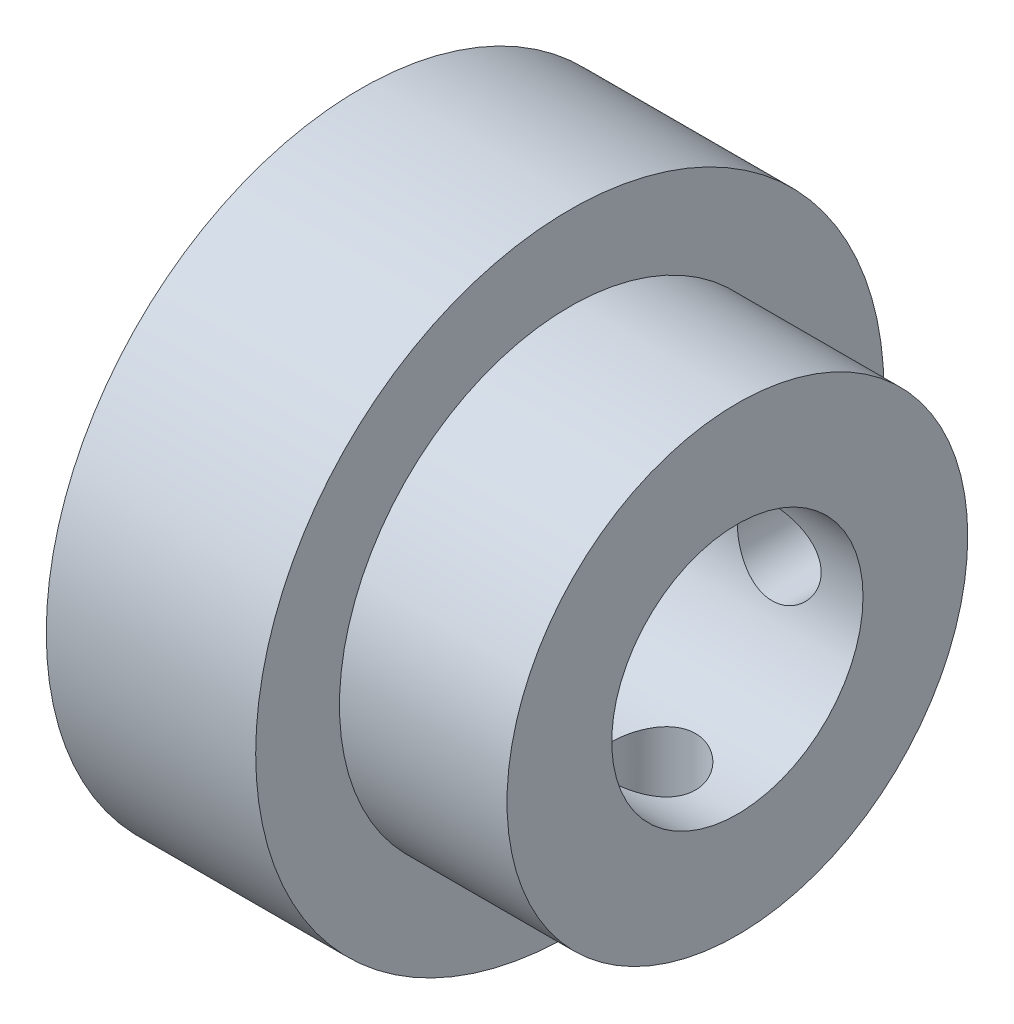
ISO-10303-21;
HEADER;
FILE_DESCRIPTION(('STEP AP214'),'2;1');
FILE_NAME('part.step','',(''),(''),'','','');
FILE_SCHEMA(('AUTOMOTIVE_DESIGN { 1 0 10303 214 1 1 1 1 }'));
ENDSEC;
DATA;
#1=APPLICATION_CONTEXT('core data for automotive mechanical design processes');
#2=APPLICATION_PROTOCOL_DEFINITION('international standard','automotive_design',2000,#1);
#3=PRODUCT_CONTEXT('',#1,'mechanical');
#4=PRODUCT('Part','Part','',(#3));
#5=PRODUCT_RELATED_PRODUCT_CATEGORY('part','',(#4));
#6=PRODUCT_DEFINITION_FORMATION('','',#4);
#7=PRODUCT_DEFINITION_CONTEXT('part definition',#1,'design');
#8=PRODUCT_DEFINITION('design','',#6,#7);
#9=PRODUCT_DEFINITION_SHAPE('','',#8);
#10=(LENGTH_UNIT() NAMED_UNIT(*) SI_UNIT(.MILLI.,.METRE.));
#11=(NAMED_UNIT(*) PLANE_ANGLE_UNIT() SI_UNIT($,.RADIAN.));
#12=(NAMED_UNIT(*) SI_UNIT($,.STERADIAN.) SOLID_ANGLE_UNIT());
#13=UNCERTAINTY_MEASURE_WITH_UNIT(LENGTH_MEASURE(1.E-05),#10,'distance_accuracy_value','');
#14=(GEOMETRIC_REPRESENTATION_CONTEXT(3) GLOBAL_UNCERTAINTY_ASSIGNED_CONTEXT((#13)) GLOBAL_UNIT_ASSIGNED_CONTEXT((#10,
#11,#12)) REPRESENTATION_CONTEXT('',''));
#15=CARTESIAN_POINT('',(0.,0.,0.));
#16=DIRECTION('',(0.,0.,1.));
#17=DIRECTION('',(1.,0.,0.));
#18=AXIS2_PLACEMENT_3D('',#15,#16,#17);
#19=CARTESIAN_POINT('',(88.99,0.,0.));
#20=DIRECTION('',(1.,0.,0.));
#21=DIRECTION('',(0.,0.,-1.));
#22=AXIS2_PLACEMENT_3D('',#19,#20,#21);
#23=CYLINDRICAL_SURFACE('',#22,6.);
#24=CARTESIAN_POINT('',(-11.1754862776445,-5.65685424949238,2.));
#25=CARTESIAN_POINT('',(-11.0665499279724,-5.65685389060868,2.00000051589543));
#26=CARTESIAN_POINT('',(-10.9576166779973,-5.66003538581715,1.99106956737104));
#27=CARTESIAN_POINT('',(-10.742977435656,-5.67235148162509,1.95570226337762));
#28=CARTESIAN_POINT('',(-10.6372719778996,-5.68148706284377,1.92926302433679));
#29=CARTESIAN_POINT('',(-10.43223249165,-5.70456407377583,1.85991097136981));
#30=CARTESIAN_POINT('',(-10.3328864187591,-5.71849607942643,1.81703044280649));
#31=CARTESIAN_POINT('',(-10.1427661805486,-5.74958244020649,1.71612325688276));
#32=CARTESIAN_POINT('',(-10.0519939125373,-5.76673750607224,1.65809325772036));
#33=CARTESIAN_POINT('',(-9.8780463529679,-5.80308978814946,1.52610229288575));
#34=CARTESIAN_POINT('',(-9.79525542030107,-5.82233789689288,1.45164868275584));
#35=CARTESIAN_POINT('',(-9.64307267519525,-5.86027729602006,1.28997533442879));
#36=CARTESIAN_POINT('',(-9.57368301447979,-5.87896849657923,1.20275355010475));
#37=CARTESIAN_POINT('',(-9.44852848298534,-5.91427733843598,1.01520901593002));
#38=CARTESIAN_POINT('',(-9.39316633640861,-5.93082815403211,0.914603822449048));
#39=CARTESIAN_POINT('',(-9.30030310738951,-5.95939173541966,0.704862445974945));
#40=CARTESIAN_POINT('',(-9.26279721129072,-5.97140572406004,0.595728571374421));
#41=CARTESIAN_POINT('',(-9.20801456837975,-5.98918150863813,0.376057634866986));
#42=CARTESIAN_POINT('',(-9.19007938513052,-5.99514629555118,0.265701509705934));
#43=CARTESIAN_POINT('',(-9.17285369092321,-6.00087216436495,0.043395749648177));
#44=CARTESIAN_POINT('',(-9.17355837433971,-6.00063484525791,-0.0685534670877946));
#45=CARTESIAN_POINT('',(-9.19317478677659,-5.99412079237462,-0.286207030387631));
#46=CARTESIAN_POINT('',(-9.21137133459351,-5.98808129510234,-0.391984097183314));
#47=CARTESIAN_POINT('',(-9.26427223960548,-5.97093934679463,-0.598886877644344));
#48=CARTESIAN_POINT('',(-9.29897771560418,-5.95983655262363,-0.700012275558433));
#49=CARTESIAN_POINT('',(-9.38432891225665,-5.93351340586448,-0.896304949683947));
#50=CARTESIAN_POINT('',(-9.43517815473756,-5.91824085048031,-0.991376441937692));
#51=CARTESIAN_POINT('',(-9.55120568854185,-5.88516786077838,-1.17184865105465));
#52=CARTESIAN_POINT('',(-9.61638796429979,-5.86736672402933,-1.25724666877068));
#53=CARTESIAN_POINT('',(-9.76283506456393,-5.83012383699793,-1.42020173310262));
#54=CARTESIAN_POINT('',(-9.8447125933275,-5.81064430337755,-1.49720031413055));
#55=CARTESIAN_POINT('',(-10.0203837290978,-5.77294670497801,-1.63655451919635));
#56=CARTESIAN_POINT('',(-10.1141791691006,-5.7547288349123,-1.69890788656309));
#57=CARTESIAN_POINT('',(-10.3127935288514,-5.72141050242224,-1.80797491007149));
#58=CARTESIAN_POINT('',(-10.4177505402801,-5.70635818569495,-1.85445292724268));
#59=CARTESIAN_POINT('',(-10.6346290660734,-5.68163301648769,-1.92888638653867));
#60=CARTESIAN_POINT('',(-10.746547640057,-5.67195790974185,-1.95684959149499));
#61=CARTESIAN_POINT('',(-10.9687629884677,-5.6595927263117,-1.99232256419504));
#62=CARTESIAN_POINT('',(-11.0789051271418,-5.65660720637512,-2.00069819101526));
#63=CARTESIAN_POINT('',(-11.2990385758727,-5.65713344118368,-1.99921087781944));
#64=CARTESIAN_POINT('',(-11.4090299096925,-5.66064401583628,-1.98935125045353));
#65=CARTESIAN_POINT('',(-11.6218002090684,-5.67347236180598,-1.95245130310462));
#66=CARTESIAN_POINT('',(-11.7246971379462,-5.6825865088168,-1.92601278796137));
#67=CARTESIAN_POINT('',(-11.9245734901229,-5.70537107342046,-1.85742772512093));
#68=CARTESIAN_POINT('',(-12.0215518608261,-5.71904229869679,-1.81527839272684));
#69=CARTESIAN_POINT('',(-12.2102471193385,-5.74993755191573,-1.71494868147787));
#70=CARTESIAN_POINT('',(-12.3016995629281,-5.76726051331256,-1.65630223671699));
#71=CARTESIAN_POINT('',(-12.473778382412,-5.8033153746193,-1.52517126111512));
#72=CARTESIAN_POINT('',(-12.554401554967,-5.82204768887588,-1.45268265099756));
#73=CARTESIAN_POINT('',(-12.7065422458258,-5.85990077275698,-1.29178341180065));
#74=CARTESIAN_POINT('',(-12.7774350576822,-5.87899687155793,-1.2027745410933));
#75=CARTESIAN_POINT('',(-12.9033185623406,-5.91453703226217,-1.01365458280051));
#76=CARTESIAN_POINT('',(-12.9583098199694,-5.93098118835389,-0.913543889729103));
#77=CARTESIAN_POINT('',(-13.050326487368,-5.95928811621206,-0.70555972486459));
#78=CARTESIAN_POINT('',(-13.0874688319407,-5.97118060009062,-0.597742246642391));
#79=CARTESIAN_POINT('',(-13.1429417617647,-5.98917221675549,-0.376916931692031));
#80=CARTESIAN_POINT('',(-13.1612791374055,-5.99527344068037,-0.263910983907777));
#81=CARTESIAN_POINT('',(-13.1780104328558,-6.00083726472512,-0.0416306717200807));
#82=CARTESIAN_POINT('',(-13.1773011855093,-6.00059840178878,0.0675694478400381));
#83=CARTESIAN_POINT('',(-13.1581716613517,-5.99424393038796,0.284222290000349));
#84=CARTESIAN_POINT('',(-13.139752821339,-5.98812879867151,0.391675153638115));
#85=CARTESIAN_POINT('',(-13.0863218084926,-5.97081829908824,0.600084238864119));
#86=CARTESIAN_POINT('',(-13.0515778469387,-5.95970516722297,0.701116541825579));
#87=CARTESIAN_POINT('',(-12.9667312154502,-5.9335432140899,0.895956701879592));
#88=CARTESIAN_POINT('',(-12.9166257672505,-5.91849368096033,0.989763248284866));
#89=CARTESIAN_POINT('',(-12.8003472534405,-5.88531737655761,1.17126803261757));
#90=CARTESIAN_POINT('',(-12.7336489068812,-5.86709744983853,1.25861250311521));
#91=CARTESIAN_POINT('',(-12.5869714953321,-5.82985977583759,1.42116205254485));
#92=CARTESIAN_POINT('',(-12.5069881931191,-5.81084177546194,1.49636324324918));
#93=CARTESIAN_POINT('',(-12.3322675664706,-5.77326559651196,1.63548361766624));
#94=CARTESIAN_POINT('',(-12.2370752556913,-5.75475455977261,1.6988459319958));
#95=CARTESIAN_POINT('',(-12.036817423839,-5.7212038664603,1.80862868660223));
#96=CARTESIAN_POINT('',(-11.9317544915852,-5.70616330322498,1.85505355363895));
#97=CARTESIAN_POINT('',(-11.7195626296133,-5.68202668413029,1.92768765640833));
#98=CARTESIAN_POINT('',(-11.6127417505938,-5.67269265714364,1.95471581829904));
#99=CARTESIAN_POINT('',(-11.3957741767111,-5.66010767079036,1.99086864029853));
#100=CARTESIAN_POINT('',(-11.2856286428231,-5.65685461234922,1.99999947839318));
#101=CARTESIAN_POINT('',(-11.1754862776445,-5.65685424949238,2.));
#102=B_SPLINE_CURVE_WITH_KNOTS('',3,(#24,#25,#26,#27,#28,#29,#30,#31,#32,#33,#34,#35,#36,#37,
#38,#39,#40,#41,#42,#43,#44,#45,#46,#47,#48,#49,#50,#51,#52,#53,#54,#55,#56,#57,#58,#59,#60,#61,
#62,#63,#64,#65,#66,#67,#68,#69,#70,#71,#72,#73,#74,#75,#76,#77,#78,#79,#80,#81,#82,#83,#84,#85,
#86,#87,#88,#89,#90,#91,#92,#93,#94,#95,#96,#97,#98,#99,#100,#101),.UNSPECIFIED.,.T.,.F.,(4,2,2,
2,2,2,2,2,2,2,2,2,2,2,2,2,2,2,2,2,2,2,2,2,2,2,2,2,2,2,2,2,2,2,2,2,2,2,4),(0.,0.326401169598711,
0.652856110030329,0.978673255001656,1.30456233237089,1.64202674855136,1.97954530343976,
2.32587012287315,2.67210152773578,3.00628637529869,3.34038506604655,3.66138009651138,
3.98239688378473,4.3076330972067,4.63295983748044,4.97360348727835,5.31429959224212,
5.65985279686111,6.00526102713231,6.33508582728879,6.66485071674468,6.98328791537552,
7.30178158293891,7.63037715471429,7.95906971324254,8.30357616342185,8.64807037515064,
8.99027582381703,9.33235766008313,9.65836169355271,9.98433928019562,10.3051391208086,
10.6259970152648,10.9587103904127,11.2915300886526,11.6373780547229,11.9831355653373,
12.3132642432538,12.6432789438093),.UNSPECIFIED.);
#103=CARTESIAN_POINT('',(-11.1754862776445,-5.65685424949238,2.));
#104=VERTEX_POINT('',#103);
#105=EDGE_CURVE('E68',#104,#104,#102,.T.);
#106=ORIENTED_EDGE('',*,*,#105,.F.);
#107=EDGE_LOOP('',(#106));
#108=FACE_BOUND('',#107,.T.);
#109=CARTESIAN_POINT('',(-13.1754862776445,0.,-6.));
#110=CARTESIAN_POINT('',(-13.1754867851078,-0.109126725773447,-6.00000030601888));
#111=CARTESIAN_POINT('',(-13.1665257453901,-0.2182503890771,-5.99699539015089));
#112=CARTESIAN_POINT('',(-13.1310280600101,-0.433283521745945,-5.98530420406561));
#113=CARTESIAN_POINT('',(-13.1044895897467,-0.539192656237636,-5.97661734404305));
#114=CARTESIAN_POINT('',(-13.0348477908764,-0.744665579003552,-5.95450615812885));
#115=CARTESIAN_POINT('',(-12.991772152726,-0.844239651772068,-5.94108975461706));
#116=CARTESIAN_POINT('',(-12.8904039319678,-1.03474987361065,-5.91088891434683));
#117=CARTESIAN_POINT('',(-12.8321083476393,-1.12568431391741,-5.89410381335555));
#118=CARTESIAN_POINT('',(-12.699834667927,-1.29948335004453,-5.8582818888601));
#119=CARTESIAN_POINT('',(-12.6254238091235,-1.38200740059662,-5.83919112927569));
#120=CARTESIAN_POINT('',(-12.4639519682314,-1.53366538540417,-5.80120629566243));
#121=CARTESIAN_POINT('',(-12.3768882077875,-1.60279637097892,-5.78231226581098));
#122=CARTESIAN_POINT('',(-12.1895160472516,-1.72764988445572,-5.74626664954547));
#123=CARTESIAN_POINT('',(-12.0888987981803,-1.78292971644206,-5.72918078551376));
#124=CARTESIAN_POINT('',(-11.8791340887274,-1.87563774775544,-5.69950610837202));
#125=CARTESIAN_POINT('',(-11.769989243319,-1.91307139477353,-5.68691592321491));
#126=CARTESIAN_POINT('',(-11.5501398346511,-1.96774692301833,-5.66822606538754));
#127=CARTESIAN_POINT('',(-11.4396118606664,-1.98562689654354,-5.66192191539222));
#128=CARTESIAN_POINT('',(-11.2169587693328,-2.00268224666895,-5.65591313259015));
#129=CARTESIAN_POINT('',(-11.1048341562261,-2.00186340320944,-5.6562064604546));
#130=CARTESIAN_POINT('',(-10.8876130167565,-1.98203980740684,-5.6631803001636));
#131=CARTESIAN_POINT('',(-10.7824294718065,-1.96386782633399,-5.66956831735066));
#132=CARTESIAN_POINT('',(-10.5766994384309,-1.91121232569883,-5.68753315449102));
#133=CARTESIAN_POINT('',(-10.4761535067744,-1.87672685318374,-5.69911059568215));
#134=CARTESIAN_POINT('',(-10.2806607784616,-1.79187811612042,-5.72635822262497));
#135=CARTESIAN_POINT('',(-10.1858302267055,-1.74126809741452,-5.74209131586234));
#136=CARTESIAN_POINT('',(-10.0057444610851,-1.62577821260628,-5.77585117151452));
#137=CARTESIAN_POINT('',(-9.92049202377777,-1.56089422472801,-5.79387859580927));
#138=CARTESIAN_POINT('',(-9.75730308132299,-1.41469866536447,-5.83134658335481));
#139=CARTESIAN_POINT('',(-9.67998088862639,-1.33270630015262,-5.85081178709685));
#140=CARTESIAN_POINT('',(-9.54002374431773,-1.15667913994013,-5.88813876774073));
#141=CARTESIAN_POINT('',(-9.47739020131554,-1.06264319132163,-5.90600039076134));
#142=CARTESIAN_POINT('',(-9.36809367717439,-0.863895226092534,-5.93834215875587));
#143=CARTESIAN_POINT('',(-9.32159529496307,-0.759086552832672,-5.95278700016078));
#144=CARTESIAN_POINT('',(-9.24707992973311,-0.542538166729014,-5.97641134288869));
#145=CARTESIAN_POINT('',(-9.21905652679766,-0.430800876309906,-5.98559267309758));
#146=CARTESIAN_POINT('',(-9.18337494559981,-0.208767659058607,-5.9973525414288));
#147=CARTESIAN_POINT('',(-9.17488665929903,-0.0986191997296908,-6.00020003667456));
#148=CARTESIAN_POINT('',(-9.17615162484147,0.121550139920476,-5.99977805389654));
#149=CARTESIAN_POINT('',(-9.18590179760428,0.231571038639302,-5.99650960838724));
#150=CARTESIAN_POINT('',(-9.22271009311645,0.445039732608512,-5.98440049434208));
#151=CARTESIAN_POINT('',(-9.24925868974352,0.548585613669688,-5.97572397422384));
#152=CARTESIAN_POINT('',(-9.31827316657799,0.749711917159148,-5.9538369366014));
#153=CARTESIAN_POINT('',(-9.3607410765801,0.847291577017214,-5.9406258409335));
#154=CARTESIAN_POINT('',(-9.4616271413261,1.03657659278655,-5.91057862574579));
#155=CARTESIAN_POINT('',(-9.52043546421087,1.12805991843429,-5.89365629511572));
#156=CARTESIAN_POINT('',(-9.6518745776715,1.30012966027117,-5.85810507832525));
#157=CARTESIAN_POINT('',(-9.72450958970806,1.38071273559115,-5.83947567187655));
#158=CARTESIAN_POINT('',(-9.88544377965771,1.5325050156126,-5.80153695960889));
#159=CARTESIAN_POINT('',(-9.97430473149825,1.60312193849154,-5.78223522174855));
#160=CARTESIAN_POINT('',(-10.1630294132663,1.72851504464715,-5.74599946589417));
#161=CARTESIAN_POINT('',(-10.2628932349127,1.78329109586203,-5.72906546764004));
#162=CARTESIAN_POINT('',(-10.4708323082243,1.87519386083272,-5.69964783582767));
#163=CARTESIAN_POINT('',(-10.5788904359821,1.91235626433004,-5.68715521585957));
#164=CARTESIAN_POINT('',(-10.8002435777328,1.96778933351871,-5.66821664612899));
#165=CARTESIAN_POINT('',(-10.9135362084532,1.98606850990788,-5.66176797247278));
#166=CARTESIAN_POINT('',(-11.1358804697264,2.00255256495468,-5.65595717748354));
#167=CARTESIAN_POINT('',(-11.2448509582182,2.0017405146168,-5.6562480051483));
#168=CARTESIAN_POINT('',(-11.4610164274887,1.98248458689739,-5.66302539647734));
#169=CARTESIAN_POINT('',(-11.5682115135547,1.96404175891717,-5.66951159138723));
#170=CARTESIAN_POINT('',(-11.7757576036495,1.91074362625869,-5.68769048609783));
#171=CARTESIAN_POINT('',(-11.8761999276535,1.87620669203103,-5.69928196044955));
#172=CARTESIAN_POINT('',(-12.0699410915211,1.79195873151949,-5.72632797636937));
#173=CARTESIAN_POINT('',(-12.1632383400205,1.74224433710761,-5.74178337526786));
#174=CARTESIAN_POINT('',(-12.3444536174904,1.62652138516686,-5.77565658452092));
#175=CARTESIAN_POINT('',(-12.4319592814413,1.55989648552916,-5.79417423284274));
#176=CARTESIAN_POINT('',(-12.5948659044129,1.4132857662713,-5.83166712566505));
#177=CARTESIAN_POINT('',(-12.6702634290207,1.33329616890296,-5.85064249824744));
#178=CARTESIAN_POINT('',(-12.8097751022229,1.15848311384137,-5.88780061051088));
#179=CARTESIAN_POINT('',(-12.8733349731465,1.06320302699946,-5.90592363602513));
#180=CARTESIAN_POINT('',(-12.9834671353458,0.862714714813247,-5.93851982345224));
#181=CARTESIAN_POINT('',(-13.0300437694886,0.757509036264695,-5.95299391815859));
#182=CARTESIAN_POINT('',(-13.1029295426219,0.544987294401951,-5.97611030137083));
#183=CARTESIAN_POINT('',(-13.1300512101713,0.437975515352817,-5.98498424845045));
#184=CARTESIAN_POINT('',(-13.1663268389988,0.220640832020495,-5.99692814128443));
#185=CARTESIAN_POINT('',(-13.1754857646376,0.110318851137493,-5.9999996906381));
#186=CARTESIAN_POINT('',(-13.1754862776445,0.,-6.));
#187=B_SPLINE_CURVE_WITH_KNOTS('',3,(#109,#110,#111,#112,#113,#114,#115,#116,#117,#118,#119,
#120,#121,#122,#123,#124,#125,#126,#127,#128,#129,#130,#131,#132,#133,#134,#135,#136,#137,#138,
#139,#140,#141,#142,#143,#144,#145,#146,#147,#148,#149,#150,#151,#152,#153,#154,#155,#156,#157,
#158,#159,#160,#161,#162,#163,#164,#165,#166,#167,#168,#169,#170,#171,#172,#173,#174,#175,#176,
#177,#178,#179,#180,#181,#182,#183,#184,#185,#186),.UNSPECIFIED.,.T.,.F.,(4,2,2,2,2,2,2,2,2,2,2,
2,2,2,2,2,2,2,2,2,2,2,2,2,2,2,2,2,2,2,2,2,2,2,2,2,2,2,4),(0.,0.326974212052022,
0.653982370535042,0.980445345740547,1.3069727555982,1.64369368565512,1.9804886657506,
2.32696769646941,2.67334089385667,3.0080385148368,3.34263267974971,3.66193653102561,
3.98127861710964,4.30576342310261,4.63034205116414,4.97186611622734,5.31342291933237,
5.65836811300715,6.00319337754417,6.33307166350339,6.66289426328353,6.98316315956427,
7.30347290568208,7.63220799687473,7.96104361643782,8.30482045761504,8.64860016469993,
8.99168027653541,9.3346056941168,9.65991332128516,9.9852015870275,10.3043117416083,
10.6234927635196,10.9566013338361,11.2898042224756,11.635993216702,11.9820936230491,
12.3127311674763,12.6432773207628),.UNSPECIFIED.);
#188=CARTESIAN_POINT('',(-13.1754862776445,0.,-6.));
#189=VERTEX_POINT('',#188);
#190=EDGE_CURVE('E67',#189,#189,#187,.T.);
#191=ORIENTED_EDGE('',*,*,#190,.F.);
#192=EDGE_LOOP('',(#191));
#193=FACE_BOUND('',#192,.T.);
#194=CARTESIAN_POINT('',(-7.17548627764453,0.,0.));
#195=DIRECTION('',(1.,0.,0.));
#196=DIRECTION('',(0.,0.,-1.));
#197=AXIS2_PLACEMENT_3D('',#194,#195,#196);
#198=CIRCLE('',#197,6.);
#199=CARTESIAN_POINT('',(-7.17548627764453,0.,-6.));
#200=VERTEX_POINT('',#199);
#201=EDGE_CURVE('E89',#200,#200,#198,.T.);
#202=ORIENTED_EDGE('',*,*,#201,.T.);
#203=EDGE_LOOP('',(#202));
#204=FACE_BOUND('',#203,.T.);
#205=CARTESIAN_POINT('',(-25.1754862776445,0.,0.));
#206=DIRECTION('',(1.,0.,0.));
#207=DIRECTION('',(0.,0.,-1.));
#208=AXIS2_PLACEMENT_3D('',#205,#206,#207);
#209=CIRCLE('',#208,6.);
#210=CARTESIAN_POINT('',(-25.1754862776445,0.,-6.));
#211=VERTEX_POINT('',#210);
#212=EDGE_CURVE('E10',#211,#211,#209,.T.);
#213=ORIENTED_EDGE('',*,*,#212,.F.);
#214=EDGE_LOOP('',(#213));
#215=FACE_BOUND('',#214,.T.);
#216=ADVANCED_FACE('F37',(#108,#193,#204,#215),#23,.F.);
#217=CARTESIAN_POINT('',(-25.1754862776445,6.,0.));
#218=DIRECTION('',(-1.,0.,0.));
#219=DIRECTION('',(0.,0.,1.));
#220=AXIS2_PLACEMENT_3D('',#217,#218,#219);
#221=PLANE('',#220);
#222=ORIENTED_EDGE('',*,*,#212,.T.);
#223=EDGE_LOOP('',(#222));
#224=FACE_BOUND('',#223,.T.);
#225=CARTESIAN_POINT('',(-25.1754862776445,0.,0.));
#226=DIRECTION('',(1.,0.,0.));
#227=DIRECTION('',(0.,0.,-1.));
#228=AXIS2_PLACEMENT_3D('',#225,#226,#227);
#229=CIRCLE('',#228,15.);
#230=CARTESIAN_POINT('',(-25.1754862776445,0.,-15.));
#231=VERTEX_POINT('',#230);
#232=EDGE_CURVE('E51',#231,#231,#229,.T.);
#233=ORIENTED_EDGE('',*,*,#232,.F.);
#234=EDGE_LOOP('',(#233));
#235=FACE_BOUND('',#234,.T.);
#236=ADVANCED_FACE('F112',(#224,#235),#221,.T.);
#237=CARTESIAN_POINT('',(88.99,0.,0.));
#238=DIRECTION('',(1.,0.,0.));
#239=DIRECTION('',(0.,0.,-1.));
#240=AXIS2_PLACEMENT_3D('',#237,#238,#239);
#241=CYLINDRICAL_SURFACE('',#240,15.);
#242=ORIENTED_EDGE('',*,*,#232,.T.);
#243=EDGE_LOOP('',(#242));
#244=FACE_BOUND('',#243,.T.);
#245=CARTESIAN_POINT('',(-15.1754862776445,0.,0.));
#246=DIRECTION('',(1.,0.,0.));
#247=DIRECTION('',(0.,0.,-1.));
#248=AXIS2_PLACEMENT_3D('',#245,#246,#247);
#249=CIRCLE('',#248,15.);
#250=CARTESIAN_POINT('',(-15.1754862776445,0.,-15.));
#251=VERTEX_POINT('',#250);
#252=EDGE_CURVE('E57',#251,#251,#249,.T.);
#253=ORIENTED_EDGE('',*,*,#252,.F.);
#254=EDGE_LOOP('',(#253));
#255=FACE_BOUND('',#254,.T.);
#256=ADVANCED_FACE('F110',(#244,#255),#241,.T.);
#257=CARTESIAN_POINT('',(-15.1754862776445,15.,0.));
#258=DIRECTION('',(1.,0.,0.));
#259=DIRECTION('',(0.,0.,-1.));
#260=AXIS2_PLACEMENT_3D('',#257,#258,#259);
#261=PLANE('',#260);
#262=ORIENTED_EDGE('',*,*,#252,.T.);
#263=EDGE_LOOP('',(#262));
#264=FACE_BOUND('',#263,.T.);
#265=CARTESIAN_POINT('',(-15.1754862776445,0.,0.));
#266=DIRECTION('',(1.,0.,0.));
#267=DIRECTION('',(0.,0.,-1.));
#268=AXIS2_PLACEMENT_3D('',#265,#266,#267);
#269=CIRCLE('',#268,11.);
#270=CARTESIAN_POINT('',(-15.1754862776445,0.,-11.));
#271=VERTEX_POINT('',#270);
#272=EDGE_CURVE('E100',#271,#271,#269,.T.);
#273=ORIENTED_EDGE('',*,*,#272,.F.);
#274=EDGE_LOOP('',(#273));
#275=FACE_BOUND('',#274,.T.);
#276=ADVANCED_FACE('F107',(#264,#275),#261,.T.);
#277=CARTESIAN_POINT('',(88.99,0.,0.));
#278=DIRECTION('',(1.,0.,0.));
#279=DIRECTION('',(0.,0.,-1.));
#280=AXIS2_PLACEMENT_3D('',#277,#278,#279);
#281=CYLINDRICAL_SURFACE('',#280,11.);
#282=CARTESIAN_POINT('',(-11.1754862776445,-10.816653826392,2.));
#283=CARTESIAN_POINT('',(-11.2868264002175,-10.8166559469823,1.99999566748834));
#284=CARTESIAN_POINT('',(-11.3982234689325,-10.818391586416,1.9906710042305));
#285=CARTESIAN_POINT('',(-11.6178808935175,-10.825138630904,1.953641319662));
#286=CARTESIAN_POINT('',(-11.7261384373138,-10.8301528833982,1.92592032102069));
#287=CARTESIAN_POINT('',(-11.936306590663,-10.8428709030557,1.85297369289719));
#288=CARTESIAN_POINT('',(-12.0382228429526,-10.8505722376174,1.80776389192774));
#289=CARTESIAN_POINT('',(-12.2330161692735,-10.8677937983012,1.70116425408316));
#290=CARTESIAN_POINT('',(-12.3258940356609,-10.8773138647657,1.6397758372698));
#291=CARTESIAN_POINT('',(-12.5010697250863,-10.8972247379328,1.50179524823966));
#292=CARTESIAN_POINT('',(-12.5832463518785,-10.9076236306456,1.4250503534781));
#293=CARTESIAN_POINT('',(-12.733631840479,-10.9280489317643,1.25886539634162));
#294=CARTESIAN_POINT('',(-12.8018398112899,-10.9380753163763,1.1694245247635));
#295=CARTESIAN_POINT('',(-12.9228135960948,-10.9567122399244,0.979593418999867));
#296=CARTESIAN_POINT('',(-12.9754655476403,-10.965312146403,0.879129490479887));
#297=CARTESIAN_POINT('',(-13.0630996106707,-10.9800367733651,0.670599774437609));
#298=CARTESIAN_POINT('',(-13.0980830881539,-10.98616168519,0.562534575326679));
#299=CARTESIAN_POINT('',(-13.1490135109,-10.9951891058833,0.343124837820858));
#300=CARTESIAN_POINT('',(-13.1651645919653,-10.9981261454525,0.231829128518768));
#301=CARTESIAN_POINT('',(-13.1786074451069,-11.0005658088946,0.00807147296592429));
#302=CARTESIAN_POINT('',(-13.1759007312161,-11.0000687084839,-0.104390378935038));
#303=CARTESIAN_POINT('',(-13.1518621355666,-10.9957231855211,-0.32588919614074));
#304=CARTESIAN_POINT('',(-13.1307500241301,-10.9919143087691,-0.43495090005335));
#305=CARTESIAN_POINT('',(-13.070847080183,-10.9814174690798,-0.647957490603366));
#306=CARTESIAN_POINT('',(-13.0320556322583,-10.974729405919,-0.751902198979603));
#307=CARTESIAN_POINT('',(-12.9376832178654,-10.9591592037236,-0.952366225453847));
#308=CARTESIAN_POINT('',(-12.8820136336107,-10.9502655302338,-1.04884289251747));
#309=CARTESIAN_POINT('',(-12.7555303877198,-10.9312689682172,-1.23116763357293));
#310=CARTESIAN_POINT('',(-12.684715274709,-10.9211659638428,-1.31701468769822));
#311=CARTESIAN_POINT('',(-12.5287378230653,-10.9006990809284,-1.47694445054394));
#312=CARTESIAN_POINT('',(-12.4433832597255,-10.8903335415211,-1.55083959404949));
#313=CARTESIAN_POINT('',(-12.2613922137236,-10.8706496206858,-1.68329271964166));
#314=CARTESIAN_POINT('',(-12.1647555848793,-10.861331252829,-1.74185050296967));
#315=CARTESIAN_POINT('',(-11.9627037671577,-10.8447947340983,-1.84201538249093));
#316=CARTESIAN_POINT('',(-11.8572754460047,-10.8375798001274,-1.88359655385222));
#317=CARTESIAN_POINT('',(-11.6407688277562,-10.8261173347694,-1.94840376886998));
#318=CARTESIAN_POINT('',(-11.5296911311334,-10.8218694887144,-1.97163175896675));
#319=CARTESIAN_POINT('',(-11.3067264764391,-10.8168840409274,-1.99880217851546));
#320=CARTESIAN_POINT('',(-11.1948733449749,-10.8160975038278,-2.00301348489164));
#321=CARTESIAN_POINT('',(-10.9720617270835,-10.8179929515389,-1.99275054778849));
#322=CARTESIAN_POINT('',(-10.8611031994306,-10.8206747755886,-1.97827717035788));
#323=CARTESIAN_POINT('',(-10.6441059335922,-10.8291592937867,-1.93128609638897));
#324=CARTESIAN_POINT('',(-10.5380358936365,-10.8349378000789,-1.89890818855376));
#325=CARTESIAN_POINT('',(-10.3328265588161,-10.8489439080076,-1.81717497571878));
#326=CARTESIAN_POINT('',(-10.2336877485589,-10.8571716806773,-1.76781848506108));
#327=CARTESIAN_POINT('',(-10.0439670816293,-10.8752613415266,-1.65290586187994));
#328=CARTESIAN_POINT('',(-9.95349015956015,-10.8851400484298,-1.58717917941566));
#329=CARTESIAN_POINT('',(-9.78475258604678,-10.9053706629202,-1.44162304950736));
#330=CARTESIAN_POINT('',(-9.70649296564488,-10.91572261035,-1.36179241301324));
#331=CARTESIAN_POINT('',(-9.56341343149475,-10.9358898604531,-1.18909630007261));
#332=CARTESIAN_POINT('',(-9.49877392228273,-10.9456968282676,-1.09608023252377));
#333=CARTESIAN_POINT('',(-9.38603997156154,-10.9635308137777,-0.900352619793528));
#334=CARTESIAN_POINT('',(-9.33794492036736,-10.9715578970606,-0.797641432067848));
#335=CARTESIAN_POINT('',(-9.25993823900809,-10.9848917263157,-0.585948218345342));
#336=CARTESIAN_POINT('',(-9.229936372768,-10.9902119510479,-0.47700032935395));
#337=CARTESIAN_POINT('',(-9.18867893434737,-10.9975899747809,-0.25550664896348));
#338=CARTESIAN_POINT('',(-9.17742151250782,-10.9996480956777,-0.142961213679231));
#339=CARTESIAN_POINT('',(-9.17403375653902,-11.0002641421388,0.0807996190288168));
#340=CARTESIAN_POINT('',(-9.18163038915984,-10.9988720323112,0.192010837925448));
#341=CARTESIAN_POINT('',(-9.21513922406847,-10.9928473390214,0.411544538990867));
#342=CARTESIAN_POINT('',(-9.24105127284354,-10.9882147827193,0.519867045363828));
#343=CARTESIAN_POINT('',(-9.3103431811338,-10.9762290690773,0.730415433440433));
#344=CARTESIAN_POINT('',(-9.35369562302009,-10.96888018348,0.832650596646201));
#345=CARTESIAN_POINT('',(-9.45660568045329,-10.9522592239203,1.02843701194217));
#346=CARTESIAN_POINT('',(-9.51616429392195,-10.9429870315355,1.12198772879735));
#347=CARTESIAN_POINT('',(-9.65074391620642,-10.9233859020729,1.29911459753549));
#348=CARTESIAN_POINT('',(-9.72596297302887,-10.9130443794735,1.38253889858449));
#349=CARTESIAN_POINT('',(-9.88931579433807,-10.8925517029222,1.53567622355086));
#350=CARTESIAN_POINT('',(-9.97745258620614,-10.8824005942262,1.60538602436339));
#351=CARTESIAN_POINT('',(-10.1650459532456,-10.8633428283932,1.72967671803608));
#352=CARTESIAN_POINT('',(-10.2645935169559,-10.8544476470463,1.78412208501856));
#353=CARTESIAN_POINT('',(-10.4715495543705,-10.8390461745677,1.87543058906983));
#354=CARTESIAN_POINT('',(-10.5789503692523,-10.8325375922296,1.9123105996278));
#355=CARTESIAN_POINT('',(-10.7681629620768,-10.8240281075057,1.95979896205519));
#356=CARTESIAN_POINT('',(-10.8488555402531,-10.821278872104,1.97484899189766));
#357=CARTESIAN_POINT('',(-11.0115172296767,-10.8175909727573,1.99495098425024));
#358=CARTESIAN_POINT('',(-11.0934863097142,-10.8166522646159,2.00000319081575));
#359=CARTESIAN_POINT('',(-11.1754862776445,-10.816653826392,2.));
#360=B_SPLINE_CURVE_WITH_KNOTS('',3,(#282,#283,#284,#285,#286,#287,#288,#289,#290,#291,#292,
#293,#294,#295,#296,#297,#298,#299,#300,#301,#302,#303,#304,#305,#306,#307,#308,#309,#310,#311,
#312,#313,#314,#315,#316,#317,#318,#319,#320,#321,#322,#323,#324,#325,#326,#327,#328,#329,#330,
#331,#332,#333,#334,#335,#336,#337,#338,#339,#340,#341,#342,#343,#344,#345,#346,#347,#348,#349,
#350,#351,#352,#353,#354,#355,#356,#357,#358,#359),.UNSPECIFIED.,.T.,.F.,(4,2,2,2,2,2,2,2,2,2,2,
2,2,2,2,2,2,2,2,2,2,2,2,2,2,2,2,2,2,2,2,2,2,2,2,2,2,2,4),(0.,0.333720352628772,
0.667730923425362,1.00143989738151,1.33511959011685,1.6722993511526,2.00950061266478,
2.34911212511978,2.6886973772514,3.02456639415963,3.3604084455173,3.69229445292967,
4.02419201411038,4.35786328487979,4.69156654523441,5.03008350848145,5.36860485839155,
5.70764124486732,6.04664167012788,6.38083364646979,6.71501013332593,7.04661365662176,
7.37824034134339,7.71347820234125,8.04874433945132,8.38820522569594,8.72765360102076,
9.06539473675367,9.40310254298625,9.73594847886932,10.0687916249998,10.4011135484041,
10.7334559397116,11.0702887970716,11.4072007206838,11.7470154829573,12.0865031534681,
12.3322881015162,12.5780670496697),.UNSPECIFIED.);
#361=CARTESIAN_POINT('',(-11.1754862776445,-10.816653826392,2.));
#362=VERTEX_POINT('',#361);
#363=EDGE_CURVE('E41',#362,#362,#360,.T.);
#364=ORIENTED_EDGE('',*,*,#363,.F.);
#365=EDGE_LOOP('',(#364));
#366=FACE_BOUND('',#365,.T.);
#367=CARTESIAN_POINT('',(-13.1754862776445,0.,-11.));
#368=CARTESIAN_POINT('',(-13.1754819589839,0.111357271644373,-10.9999980072786));
#369=CARTESIAN_POINT('',(-13.1661545201619,0.222771449918202,-10.9982915273343));
#370=CARTESIAN_POINT('',(-13.1291128116196,0.442464406848309,-10.99164847502));
#371=CARTESIAN_POINT('',(-13.1013826290632,0.550740387266074,-10.9867091072254));
#372=CARTESIAN_POINT('',(-13.0284091479735,0.760947572513747,-10.9741532323507));
#373=CARTESIAN_POINT('',(-12.9831812454548,0.862884263930176,-10.9665390793192));
#374=CARTESIAN_POINT('',(-12.8765389464527,1.0577120033845,-10.949466714983));
#375=CARTESIAN_POINT('',(-12.8151260124563,1.15060386767904,-10.9400086703132));
#376=CARTESIAN_POINT('',(-12.6771203680018,1.32576444051238,-10.9201743349983));
#377=CARTESIAN_POINT('',(-12.6003804356638,1.40791622603346,-10.9097897259708));
#378=CARTESIAN_POINT('',(-12.4342159235547,1.55825357341079,-10.8893349521181));
#379=CARTESIAN_POINT('',(-12.3447904659554,1.62643816794977,-10.8792648091126));
#380=CARTESIAN_POINT('',(-12.1549735481848,1.74738695016477,-10.8604984020977));
#381=CARTESIAN_POINT('',(-12.0545057424142,1.80003313265556,-10.851812871101));
#382=CARTESIAN_POINT('',(-11.8459676273206,1.88765546949978,-10.836915832769));
#383=CARTESIAN_POINT('',(-11.7378979336195,1.92263305283275,-10.8307041253674));
#384=CARTESIAN_POINT('',(-11.5184716282879,1.97355197711315,-10.8215415351671));
#385=CARTESIAN_POINT('',(-11.4071636859349,1.98969666425445,-10.8185558462234));
#386=CARTESIAN_POINT('',(-11.18338187033,2.00312248736688,-10.8160783143231));
#387=CARTESIAN_POINT('',(-11.0709080961285,2.00040521296643,-10.8165861769405));
#388=CARTESIAN_POINT('',(-10.8494543635115,1.97634934427,-10.8210066504918));
#389=CARTESIAN_POINT('',(-10.7404484097488,1.95524117699072,-10.8248771281426));
#390=CARTESIAN_POINT('',(-10.5275512592774,1.89536523340026,-10.8355206127391));
#391=CARTESIAN_POINT('',(-10.4236602682927,1.85659674743188,-10.8422937363232));
#392=CARTESIAN_POINT('',(-10.2232634868658,1.76227297789295,-10.8580238155272));
#393=CARTESIAN_POINT('',(-10.1268028349784,1.7066239037154,-10.8669929171435));
#394=CARTESIAN_POINT('',(-9.94450154069924,1.58018503374043,-10.8860962201172));
#395=CARTESIAN_POINT('',(-9.85866191499829,1.50939379023584,-10.8962305328347));
#396=CARTESIAN_POINT('',(-9.69870728120016,1.35343399418352,-10.9167064080854));
#397=CARTESIAN_POINT('',(-9.62478458920762,1.2680681726569,-10.9270488181647));
#398=CARTESIAN_POINT('',(-9.4922811441637,1.08604454069331,-10.9466375043709));
#399=CARTESIAN_POINT('',(-9.43370052802327,0.989386629498157,-10.9558837707156));
#400=CARTESIAN_POINT('',(-9.3335188878595,0.787327598497296,-10.9722553782534));
#401=CARTESIAN_POINT('',(-9.29193700894855,0.681916780395492,-10.9793783255922));
#402=CARTESIAN_POINT('',(-9.22712308515083,0.465448414462666,-10.9906820547088));
#403=CARTESIAN_POINT('',(-9.20388920907062,0.354391431316065,-10.994863130091));
#404=CARTESIAN_POINT('',(-9.17669651572541,0.1314386495785,-10.9997719337866));
#405=CARTESIAN_POINT('',(-9.17247405419045,0.0195760121089351,-11.0005468934114));
#406=CARTESIAN_POINT('',(-9.18271807582602,-0.203257238970966,-10.998686302475));
#407=CARTESIAN_POINT('',(-9.19718369771627,-0.314227893453081,-10.9960509090871));
#408=CARTESIAN_POINT('',(-9.24417402720641,-0.531297097592757,-10.9876950863245));
#409=CARTESIAN_POINT('',(-9.27656614682736,-0.637425297458317,-10.9819973157216));
#410=CARTESIAN_POINT('',(-9.35834710616647,-0.84274471375661,-10.9681529512222));
#411=CARTESIAN_POINT('',(-9.40773704534223,-0.941935480960948,-10.9600061989244));
#412=CARTESIAN_POINT('',(-9.52270091544746,-1.13169524707493,-10.9420497958484));
#413=CARTESIAN_POINT('',(-9.58843696480046,-1.22216445208488,-10.932223816146));
#414=CARTESIAN_POINT('',(-9.73400665431563,-1.39088213822347,-10.9120428807109));
#415=CARTESIAN_POINT('',(-9.81384152705647,-1.46912954974332,-10.901687878785));
#416=CARTESIAN_POINT('',(-9.98653315909303,-1.6121773788768,-10.8814603955764));
#417=CARTESIAN_POINT('',(-10.0795395841704,-1.67679836741418,-10.8715955212189));
#418=CARTESIAN_POINT('',(-10.275242459051,-1.78949986552013,-10.8536151008102));
#419=CARTESIAN_POINT('',(-10.3779385623289,-1.83758096630795,-10.8454994922354));
#420=CARTESIAN_POINT('',(-10.5896370273363,-1.91557945241746,-10.8319954461548));
#421=CARTESIAN_POINT('',(-10.6986075083826,-1.9455810786184,-10.8265943801675));
#422=CARTESIAN_POINT('',(-10.9201492662756,-1.98683040178554,-10.8191012654539));
#423=CARTESIAN_POINT('',(-11.0327201624935,-1.99808007453629,-10.8170088681136));
#424=CARTESIAN_POINT('',(-11.2564716531082,-2.00144313663184,-10.8163869388262));
#425=CARTESIAN_POINT('',(-11.3676479490831,-1.99383937001232,-10.8178047454411));
#426=CARTESIAN_POINT('',(-11.5871099156619,-1.96032846912815,-10.8239270874703));
#427=CARTESIAN_POINT('',(-11.6953956011388,-1.93442142905718,-10.8286316059701));
#428=CARTESIAN_POINT('',(-11.9058624750399,-1.86515567158476,-10.8407757208091));
#429=CARTESIAN_POINT('',(-12.008053437868,-1.82182581019232,-10.8482107929975));
#430=CARTESIAN_POINT('',(-12.2037607248093,-1.71897473664823,-10.8649817751485));
#431=CARTESIAN_POINT('',(-12.2972764864901,-1.65945247569007,-10.8743178082294));
#432=CARTESIAN_POINT('',(-12.4743991522402,-1.52491543662799,-10.8940032465147));
#433=CARTESIAN_POINT('',(-12.5578478475153,-1.44969415553099,-10.9043650783111));
#434=CARTESIAN_POINT('',(-12.7110333586567,-1.28632651423364,-10.9248399206865));
#435=CARTESIAN_POINT('',(-12.7807670180368,-1.19817718680093,-10.9349528735191));
#436=CARTESIAN_POINT('',(-12.905086574768,-1.0105711896463,-10.9538897429719));
#437=CARTESIAN_POINT('',(-12.9595404628247,-0.911025849790496,-10.9627021317343));
#438=CARTESIAN_POINT('',(-13.0508654937186,-0.704073905086345,-10.9779326099335));
#439=CARTESIAN_POINT('',(-13.0877534369228,-0.59667492548667,-10.9843529858473));
#440=CARTESIAN_POINT('',(-13.1352617079467,-0.407441749458405,-10.9927407037649));
#441=CARTESIAN_POINT('',(-13.1503206106049,-0.326725427276489,-10.9954478027358));
#442=CARTESIAN_POINT('',(-13.1704343714394,-0.164016342132202,-10.9990781643304));
#443=CARTESIAN_POINT('',(-13.1754894586863,-0.0820236084408327,-11.0000014678));
#444=CARTESIAN_POINT('',(-13.1754862776445,0.,-11.));
#445=B_SPLINE_CURVE_WITH_KNOTS('',3,(#367,#368,#369,#370,#371,#372,#373,#374,#375,#376,#377,
#378,#379,#380,#381,#382,#383,#384,#385,#386,#387,#388,#389,#390,#391,#392,#393,#394,#395,#396,
#397,#398,#399,#400,#401,#402,#403,#404,#405,#406,#407,#408,#409,#410,#411,#412,#413,#414,#415,
#416,#417,#418,#419,#420,#421,#422,#423,#424,#425,#426,#427,#428,#429,#430,#431,#432,#433,#434,
#435,#436,#437,#438,#439,#440,#441,#442,#443,#444),.UNSPECIFIED.,.T.,.F.,(4,2,2,2,2,2,2,2,2,2,2,
2,2,2,2,2,2,2,2,2,2,2,2,2,2,2,2,2,2,2,2,2,2,2,2,2,2,2,4),(0.,0.333771891552332,0.66783277207259,
1.00160038286674,1.3353378446015,1.67245014596885,2.00958578663078,2.3492195220365,
2.6888257845573,3.02473021172645,3.36060633024202,3.69233367290895,4.02407434678871,
4.35769306461625,4.69134369321255,5.02993210441872,5.36852353704646,5.70749527023812,
6.04643316861453,6.38065600997364,6.71486344850797,7.0466314328543,7.3784208807422,
7.71364226795666,8.04889297616123,8.38831506130458,8.72772501252474,9.06554101076157,
9.40332141303601,9.73606509730371,10.0688070691931,10.4010002025896,10.733214857769,
11.0701111453004,11.4070848782946,11.7468860454293,12.0863615649816,12.3322171022956,
12.5780670098676),.UNSPECIFIED.);
#446=CARTESIAN_POINT('',(-13.1754862776445,0.,-11.));
#447=VERTEX_POINT('',#446);
#448=EDGE_CURVE('E60',#447,#447,#445,.T.);
#449=ORIENTED_EDGE('',*,*,#448,.F.);
#450=EDGE_LOOP('',(#449));
#451=FACE_BOUND('',#450,.T.);
#452=ORIENTED_EDGE('',*,*,#272,.T.);
#453=EDGE_LOOP('',(#452));
#454=FACE_BOUND('',#453,.T.);
#455=CARTESIAN_POINT('',(-7.17548627764453,0.,0.));
#456=DIRECTION('',(1.,0.,0.));
#457=DIRECTION('',(0.,0.,-1.));
#458=AXIS2_PLACEMENT_3D('',#455,#456,#457);
#459=CIRCLE('',#458,11.);
#460=CARTESIAN_POINT('',(-7.17548627764453,0.,-11.));
#461=VERTEX_POINT('',#460);
#462=EDGE_CURVE('E96',#461,#461,#459,.T.);
#463=ORIENTED_EDGE('',*,*,#462,.F.);
#464=EDGE_LOOP('',(#463));
#465=FACE_BOUND('',#464,.T.);
#466=ADVANCED_FACE('F69',(#366,#451,#454,#465),#281,.T.);
#467=CARTESIAN_POINT('',(-7.17548627764453,11.,0.));
#468=DIRECTION('',(1.,0.,0.));
#469=DIRECTION('',(0.,0.,-1.));
#470=AXIS2_PLACEMENT_3D('',#467,#468,#469);
#471=PLANE('',#470);
#472=ORIENTED_EDGE('',*,*,#462,.T.);
#473=EDGE_LOOP('',(#472));
#474=FACE_BOUND('',#473,.T.);
#475=ORIENTED_EDGE('',*,*,#201,.F.);
#476=EDGE_LOOP('',(#475));
#477=FACE_BOUND('',#476,.T.);
#478=ADVANCED_FACE('F77',(#474,#477),#471,.T.);
#479=CARTESIAN_POINT('',(-11.1754862776445,0.,-15.));
#480=DIRECTION('',(0.,0.,1.));
#481=DIRECTION('',(1.,0.,0.));
#482=AXIS2_PLACEMENT_3D('',#479,#480,#481);
#483=CYLINDRICAL_SURFACE('',#482,2.);
#484=ORIENTED_EDGE('',*,*,#190,.T.);
#485=EDGE_LOOP('',(#484));
#486=FACE_BOUND('',#485,.T.);
#487=ORIENTED_EDGE('',*,*,#448,.T.);
#488=EDGE_LOOP('',(#487));
#489=FACE_BOUND('',#488,.T.);
#490=ADVANCED_FACE('F73',(#486,#489),#483,.F.);
#491=CARTESIAN_POINT('',(-11.1754862776445,-15.,0.));
#492=DIRECTION('',(0.,1.,0.));
#493=DIRECTION('',(0.,0.,1.));
#494=AXIS2_PLACEMENT_3D('',#491,#492,#493);
#495=CYLINDRICAL_SURFACE('',#494,2.);
#496=ORIENTED_EDGE('',*,*,#105,.T.);
#497=EDGE_LOOP('',(#496));
#498=FACE_BOUND('',#497,.T.);
#499=ORIENTED_EDGE('',*,*,#363,.T.);
#500=EDGE_LOOP('',(#499));
#501=FACE_BOUND('',#500,.T.);
#502=ADVANCED_FACE('F76',(#498,#501),#495,.F.);
#503=CLOSED_SHELL('',(#216,#236,#256,#276,#466,#478,#490,#502));
#504=MANIFOLD_SOLID_BREP('B2',#503);
#505=ADVANCED_BREP_SHAPE_REPRESENTATION('',(#18,#504),#14);
#506=SHAPE_DEFINITION_REPRESENTATION(#9,#505);
ENDSEC;
END-ISO-10303-21;
